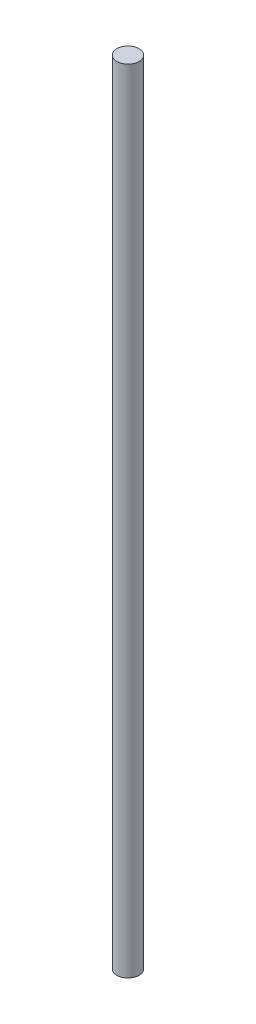
ISO-10303-21;
HEADER;
FILE_DESCRIPTION(('STEP AP214'),'2;1');
FILE_NAME('part.step','',(''),(''),'','','');
FILE_SCHEMA(('AUTOMOTIVE_DESIGN { 1 0 10303 214 1 1 1 1 }'));
ENDSEC;
DATA;
#1=APPLICATION_CONTEXT('core data for automotive mechanical design processes');
#2=APPLICATION_PROTOCOL_DEFINITION('international standard','automotive_design',2000,#1);
#3=PRODUCT_CONTEXT('',#1,'mechanical');
#4=PRODUCT('Part','Part','',(#3));
#5=PRODUCT_RELATED_PRODUCT_CATEGORY('part','',(#4));
#6=PRODUCT_DEFINITION_FORMATION('','',#4);
#7=PRODUCT_DEFINITION_CONTEXT('part definition',#1,'design');
#8=PRODUCT_DEFINITION('design','',#6,#7);
#9=PRODUCT_DEFINITION_SHAPE('','',#8);
#10=(LENGTH_UNIT() NAMED_UNIT(*) SI_UNIT(.MILLI.,.METRE.));
#11=(NAMED_UNIT(*) PLANE_ANGLE_UNIT() SI_UNIT($,.RADIAN.));
#12=(NAMED_UNIT(*) SI_UNIT($,.STERADIAN.) SOLID_ANGLE_UNIT());
#13=UNCERTAINTY_MEASURE_WITH_UNIT(LENGTH_MEASURE(1.E-05),#10,'distance_accuracy_value','');
#14=(GEOMETRIC_REPRESENTATION_CONTEXT(3) GLOBAL_UNCERTAINTY_ASSIGNED_CONTEXT((#13)) GLOBAL_UNIT_ASSIGNED_CONTEXT((#10,
#11,#12)) REPRESENTATION_CONTEXT('',''));
#15=CARTESIAN_POINT('',(0.,0.,0.));
#16=DIRECTION('',(0.,0.,1.));
#17=DIRECTION('',(1.,0.,0.));
#18=AXIS2_PLACEMENT_3D('',#15,#16,#17);
#19=CARTESIAN_POINT('',(0.,355.6,0.));
#20=DIRECTION('',(0.,-1.,0.));
#21=DIRECTION('',(0.,0.,-1.));
#22=AXIS2_PLACEMENT_3D('',#19,#20,#21);
#23=CYLINDRICAL_SURFACE('',#22,5.);
#24=CARTESIAN_POINT('',(0.,355.6,0.));
#25=DIRECTION('',(0.,1.,0.));
#26=DIRECTION('',(0.,0.,1.));
#27=AXIS2_PLACEMENT_3D('',#24,#25,#26);
#28=CIRCLE('',#27,5.);
#29=CARTESIAN_POINT('',(0.,355.6,5.));
#30=VERTEX_POINT('',#29);
#31=EDGE_CURVE('E10',#30,#30,#28,.T.);
#32=ORIENTED_EDGE('',*,*,#31,.F.);
#33=EDGE_LOOP('',(#32));
#34=FACE_BOUND('',#33,.T.);
#35=CARTESIAN_POINT('',(0.,0.,0.));
#36=DIRECTION('',(0.,1.,0.));
#37=DIRECTION('',(0.,0.,1.));
#38=AXIS2_PLACEMENT_3D('',#35,#36,#37);
#39=CIRCLE('',#38,5.);
#40=CARTESIAN_POINT('',(0.,0.,5.));
#41=VERTEX_POINT('',#40);
#42=EDGE_CURVE('E34',#41,#41,#39,.T.);
#43=ORIENTED_EDGE('',*,*,#42,.T.);
#44=EDGE_LOOP('',(#43));
#45=FACE_BOUND('',#44,.T.);
#46=ADVANCED_FACE('F31',(#34,#45),#23,.T.);
#47=CARTESIAN_POINT('',(0.,355.6,0.));
#48=DIRECTION('',(0.,1.,0.));
#49=DIRECTION('',(0.,0.,1.));
#50=AXIS2_PLACEMENT_3D('',#47,#48,#49);
#51=PLANE('',#50);
#52=ORIENTED_EDGE('',*,*,#31,.T.);
#53=EDGE_LOOP('',(#52));
#54=FACE_BOUND('',#53,.T.);
#55=ADVANCED_FACE('F46',(#54),#51,.T.);
#56=CARTESIAN_POINT('',(0.,0.,0.));
#57=DIRECTION('',(0.,1.,0.));
#58=DIRECTION('',(0.,0.,1.));
#59=AXIS2_PLACEMENT_3D('',#56,#57,#58);
#60=PLANE('',#59);
#61=ORIENTED_EDGE('',*,*,#42,.F.);
#62=EDGE_LOOP('',(#61));
#63=FACE_BOUND('',#62,.T.);
#64=ADVANCED_FACE('F44',(#63),#60,.F.);
#65=CLOSED_SHELL('',(#46,#55,#64));
#66=MANIFOLD_SOLID_BREP('B2',#65);
#67=ADVANCED_BREP_SHAPE_REPRESENTATION('',(#18,#66),#14);
#68=SHAPE_DEFINITION_REPRESENTATION(#9,#67);
ENDSEC;
END-ISO-10303-21;
